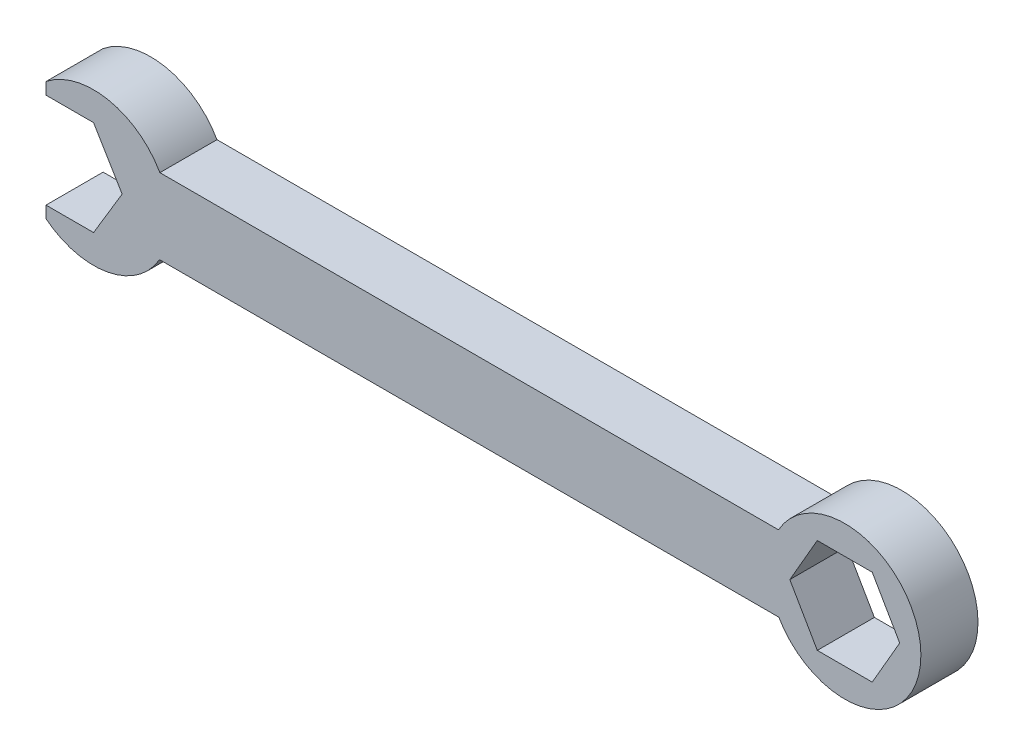
ISO-10303-21;
HEADER;
FILE_DESCRIPTION(('STEP AP214'),'2;1');
FILE_NAME('part.step','',(''),(''),'','','');
FILE_SCHEMA(('AUTOMOTIVE_DESIGN { 1 0 10303 214 1 1 1 1 }'));
ENDSEC;
DATA;
#1=APPLICATION_CONTEXT('core data for automotive mechanical design processes');
#2=APPLICATION_PROTOCOL_DEFINITION('international standard','automotive_design',2000,#1);
#3=PRODUCT_CONTEXT('',#1,'mechanical');
#4=PRODUCT('Part','Part','',(#3));
#5=PRODUCT_RELATED_PRODUCT_CATEGORY('part','',(#4));
#6=PRODUCT_DEFINITION_FORMATION('','',#4);
#7=PRODUCT_DEFINITION_CONTEXT('part definition',#1,'design');
#8=PRODUCT_DEFINITION('design','',#6,#7);
#9=PRODUCT_DEFINITION_SHAPE('','',#8);
#10=(LENGTH_UNIT() NAMED_UNIT(*) SI_UNIT(.MILLI.,.METRE.));
#11=(NAMED_UNIT(*) PLANE_ANGLE_UNIT() SI_UNIT($,.RADIAN.));
#12=(NAMED_UNIT(*) SI_UNIT($,.STERADIAN.) SOLID_ANGLE_UNIT());
#13=UNCERTAINTY_MEASURE_WITH_UNIT(LENGTH_MEASURE(1.E-05),#10,'distance_accuracy_value','');
#14=(GEOMETRIC_REPRESENTATION_CONTEXT(3) GLOBAL_UNCERTAINTY_ASSIGNED_CONTEXT((#13)) GLOBAL_UNIT_ASSIGNED_CONTEXT((#10,
#11,#12)) REPRESENTATION_CONTEXT('',''));
#15=CARTESIAN_POINT('',(0.,0.,0.));
#16=DIRECTION('',(0.,0.,1.));
#17=DIRECTION('',(1.,0.,0.));
#18=AXIS2_PLACEMENT_3D('',#15,#16,#17);
#19=CARTESIAN_POINT('',(0.,4.99620648645434,7.62));
#20=DIRECTION('',(0.,-1.,0.));
#21=DIRECTION('',(1.,0.,0.));
#22=AXIS2_PLACEMENT_3D('',#19,#20,#21);
#23=PLANE('',#22);
#24=DIRECTION('',(-1.,0.,0.));
#25=VECTOR('',#24,1.);
#26=CARTESIAN_POINT('',(0.,4.99620648645434,0.));
#27=LINE('',#26,#25);
#28=CARTESIAN_POINT('',(91.3966672111429,4.99620648645434,0.));
#29=VERTEX_POINT('',#28);
#30=CARTESIAN_POINT('',(8.84666721114294,4.99620648645434,0.));
#31=VERTEX_POINT('',#30);
#32=EDGE_CURVE('E214',#29,#31,#27,.T.);
#33=ORIENTED_EDGE('',*,*,#32,.T.);
#34=DIRECTION('',(0.,0.,-1.));
#35=VECTOR('',#34,1.);
#36=CARTESIAN_POINT('',(8.84666721114294,4.99620648645434,7.62));
#37=LINE('',#36,#35);
#38=CARTESIAN_POINT('',(8.84666721114294,4.99620648645434,7.62));
#39=VERTEX_POINT('',#38);
#40=EDGE_CURVE('E11',#39,#31,#37,.T.);
#41=ORIENTED_EDGE('',*,*,#40,.F.);
#42=DIRECTION('',(-1.,0.,0.));
#43=VECTOR('',#42,1.);
#44=CARTESIAN_POINT('',(0.,4.99620648645434,7.62));
#45=LINE('',#44,#43);
#46=CARTESIAN_POINT('',(91.3966672111429,4.99620648645434,7.62));
#47=VERTEX_POINT('',#46);
#48=EDGE_CURVE('E297',#47,#39,#45,.T.);
#49=ORIENTED_EDGE('',*,*,#48,.F.);
#50=DIRECTION('',(0.,0.,-1.));
#51=VECTOR('',#50,1.);
#52=CARTESIAN_POINT('',(91.3966672111429,4.99620648645434,7.62));
#53=LINE('',#52,#51);
#54=EDGE_CURVE('E239',#47,#29,#53,.T.);
#55=ORIENTED_EDGE('',*,*,#54,.T.);
#56=EDGE_LOOP('',(#33,#41,#49,#55));
#57=FACE_BOUND('',#56,.T.);
#58=ADVANCED_FACE('F43',(#57),#23,.F.);
#59=CARTESIAN_POINT('',(0.,0.,7.62));
#60=DIRECTION('',(0.,0.,-1.));
#61=DIRECTION('',(-1.,0.,0.));
#62=AXIS2_PLACEMENT_3D('',#59,#60,#61);
#63=CYLINDRICAL_SURFACE('',#62,10.16);
#64=CARTESIAN_POINT('',(0.,0.,0.));
#65=DIRECTION('',(0.,0.,1.));
#66=DIRECTION('',(1.,0.,0.));
#67=AXIS2_PLACEMENT_3D('',#64,#65,#66);
#68=CIRCLE('',#67,10.16);
#69=CARTESIAN_POINT('',(-6.35,7.93114745796597,0.));
#70=VERTEX_POINT('',#69);
#71=EDGE_CURVE('E217',#31,#70,#68,.T.);
#72=ORIENTED_EDGE('',*,*,#71,.T.);
#73=DIRECTION('',(0.,0.,-1.));
#74=VECTOR('',#73,1.);
#75=CARTESIAN_POINT('',(-6.35,7.93114745796597,7.62));
#76=LINE('',#75,#74);
#77=CARTESIAN_POINT('',(-6.35,7.93114745796597,7.62));
#78=VERTEX_POINT('',#77);
#79=EDGE_CURVE('E52',#78,#70,#76,.T.);
#80=ORIENTED_EDGE('',*,*,#79,.F.);
#81=CARTESIAN_POINT('',(0.,0.,7.62));
#82=DIRECTION('',(0.,0.,1.));
#83=DIRECTION('',(1.,0.,0.));
#84=AXIS2_PLACEMENT_3D('',#81,#82,#83);
#85=CIRCLE('',#84,10.16);
#86=EDGE_CURVE('E299',#39,#78,#85,.T.);
#87=ORIENTED_EDGE('',*,*,#86,.F.);
#88=ORIENTED_EDGE('',*,*,#40,.T.);
#89=EDGE_LOOP('',(#72,#80,#87,#88));
#90=FACE_BOUND('',#89,.T.);
#91=ADVANCED_FACE('F345',(#90),#63,.T.);
#92=CARTESIAN_POINT('',(-6.35,0.,7.62));
#93=DIRECTION('',(-1.,0.,0.));
#94=DIRECTION('',(0.,0.,1.));
#95=AXIS2_PLACEMENT_3D('',#92,#93,#94);
#96=PLANE('',#95);
#97=DIRECTION('',(0.,1.,0.));
#98=VECTOR('',#97,1.);
#99=CARTESIAN_POINT('',(-6.35,0.,0.));
#100=LINE('',#99,#98);
#101=CARTESIAN_POINT('',(-6.35,6.35,0.));
#102=VERTEX_POINT('',#101);
#103=EDGE_CURVE('E222',#102,#70,#100,.T.);
#104=ORIENTED_EDGE('',*,*,#103,.F.);
#105=DIRECTION('',(0.,0.,-1.));
#106=VECTOR('',#105,1.);
#107=CARTESIAN_POINT('',(-6.35,6.35,7.62));
#108=LINE('',#107,#106);
#109=CARTESIAN_POINT('',(-6.35,6.35,7.62));
#110=VERTEX_POINT('',#109);
#111=EDGE_CURVE('E255',#110,#102,#108,.T.);
#112=ORIENTED_EDGE('',*,*,#111,.F.);
#113=DIRECTION('',(0.,1.,0.));
#114=VECTOR('',#113,1.);
#115=CARTESIAN_POINT('',(-6.35,0.,7.62));
#116=LINE('',#115,#114);
#117=EDGE_CURVE('E305',#110,#78,#116,.T.);
#118=ORIENTED_EDGE('',*,*,#117,.T.);
#119=ORIENTED_EDGE('',*,*,#79,.T.);
#120=EDGE_LOOP('',(#104,#112,#118,#119));
#121=FACE_BOUND('',#120,.T.);
#122=ADVANCED_FACE('F350',(#121),#96,.T.);
#123=CARTESIAN_POINT('',(0.,6.35,7.62));
#124=DIRECTION('',(0.,-1.,0.));
#125=DIRECTION('',(1.,0.,0.));
#126=AXIS2_PLACEMENT_3D('',#123,#124,#125);
#127=PLANE('',#126);
#128=DIRECTION('',(-1.,0.,0.));
#129=VECTOR('',#128,1.);
#130=CARTESIAN_POINT('',(0.,6.35,0.));
#131=LINE('',#130,#129);
#132=CARTESIAN_POINT('',(0.,6.35,0.));
#133=VERTEX_POINT('',#132);
#134=EDGE_CURVE('E221',#133,#102,#131,.T.);
#135=ORIENTED_EDGE('',*,*,#134,.F.);
#136=DIRECTION('',(0.,0.,-1.));
#137=VECTOR('',#136,1.);
#138=CARTESIAN_POINT('',(0.,6.35,7.62));
#139=LINE('',#138,#137);
#140=CARTESIAN_POINT('',(0.,6.35,7.62));
#141=VERTEX_POINT('',#140);
#142=EDGE_CURVE('E252',#141,#133,#139,.T.);
#143=ORIENTED_EDGE('',*,*,#142,.F.);
#144=DIRECTION('',(-1.,0.,0.));
#145=VECTOR('',#144,1.);
#146=CARTESIAN_POINT('',(0.,6.35,7.62));
#147=LINE('',#146,#145);
#148=EDGE_CURVE('E304',#141,#110,#147,.T.);
#149=ORIENTED_EDGE('',*,*,#148,.T.);
#150=ORIENTED_EDGE('',*,*,#111,.T.);
#151=EDGE_LOOP('',(#135,#143,#149,#150));
#152=FACE_BOUND('',#151,.T.);
#153=ADVANCED_FACE('F381',(#152),#127,.T.);
#154=CARTESIAN_POINT('',(2.80147058823529,1.68088235294118,7.62));
#155=DIRECTION('',(0.857492925712544,0.514495755427527,0.));
#156=DIRECTION('',(-0.514495755427527,0.857492925712544,0.));
#157=AXIS2_PLACEMENT_3D('',#154,#155,#156);
#158=PLANE('',#157);
#159=DIRECTION('',(0.514495755427527,-0.857492925712544,0.));
#160=VECTOR('',#159,1.);
#161=CARTESIAN_POINT('',(2.80147058823529,1.68088235294118,0.));
#162=LINE('',#161,#160);
#163=CARTESIAN_POINT('',(3.81,0.,0.));
#164=VERTEX_POINT('',#163);
#165=EDGE_CURVE('E230',#133,#164,#162,.T.);
#166=ORIENTED_EDGE('',*,*,#165,.T.);
#167=DIRECTION('',(0.,0.,-1.));
#168=VECTOR('',#167,1.);
#169=CARTESIAN_POINT('',(3.81,0.,7.62));
#170=LINE('',#169,#168);
#171=CARTESIAN_POINT('',(3.81,0.,7.62));
#172=VERTEX_POINT('',#171);
#173=EDGE_CURVE('E248',#172,#164,#170,.T.);
#174=ORIENTED_EDGE('',*,*,#173,.F.);
#175=DIRECTION('',(0.514495755427527,-0.857492925712544,0.));
#176=VECTOR('',#175,1.);
#177=CARTESIAN_POINT('',(2.80147058823529,1.68088235294118,7.62));
#178=LINE('',#177,#176);
#179=EDGE_CURVE('E306',#141,#172,#178,.T.);
#180=ORIENTED_EDGE('',*,*,#179,.F.);
#181=ORIENTED_EDGE('',*,*,#142,.T.);
#182=EDGE_LOOP('',(#166,#174,#180,#181));
#183=FACE_BOUND('',#182,.T.);
#184=ADVANCED_FACE('F380',(#183),#158,.F.);
#185=CARTESIAN_POINT('',(2.80147058823523,-1.68088235294121,7.62));
#186=DIRECTION('',(0.857492925712534,-0.514495755427543,0.));
#187=DIRECTION('',(0.514495755427543,0.857492925712534,0.));
#188=AXIS2_PLACEMENT_3D('',#185,#186,#187);
#189=PLANE('',#188);
#190=DIRECTION('',(-0.514495755427543,-0.857492925712534,0.));
#191=VECTOR('',#190,1.);
#192=CARTESIAN_POINT('',(2.80147058823523,-1.68088235294121,0.));
#193=LINE('',#192,#191);
#194=CARTESIAN_POINT('',(-1.64798730217797E-13,-6.35,0.));
#195=VERTEX_POINT('',#194);
#196=EDGE_CURVE('E228',#164,#195,#193,.T.);
#197=ORIENTED_EDGE('',*,*,#196,.T.);
#198=DIRECTION('',(0.,0.,-1.));
#199=VECTOR('',#198,1.);
#200=CARTESIAN_POINT('',(-1.64798730217797E-13,-6.35,7.62));
#201=LINE('',#200,#199);
#202=CARTESIAN_POINT('',(-1.64798730217797E-13,-6.35,7.62));
#203=VERTEX_POINT('',#202);
#204=EDGE_CURVE('E246',#203,#195,#201,.T.);
#205=ORIENTED_EDGE('',*,*,#204,.F.);
#206=DIRECTION('',(-0.514495755427543,-0.857492925712534,0.));
#207=VECTOR('',#206,1.);
#208=CARTESIAN_POINT('',(2.80147058823523,-1.68088235294121,7.62));
#209=LINE('',#208,#207);
#210=EDGE_CURVE('E309',#172,#203,#209,.T.);
#211=ORIENTED_EDGE('',*,*,#210,.F.);
#212=ORIENTED_EDGE('',*,*,#173,.T.);
#213=EDGE_LOOP('',(#197,#205,#211,#212));
#214=FACE_BOUND('',#213,.T.);
#215=ADVANCED_FACE('F372',(#214),#189,.F.);
#216=CARTESIAN_POINT('',(0.,-6.35,7.62));
#217=DIRECTION('',(0.,-1.,0.));
#218=DIRECTION('',(0.,0.,-1.));
#219=AXIS2_PLACEMENT_3D('',#216,#217,#218);
#220=PLANE('',#219);
#221=DIRECTION('',(-1.,0.,0.));
#222=VECTOR('',#221,1.);
#223=CARTESIAN_POINT('',(0.,-6.35,0.));
#224=LINE('',#223,#222);
#225=CARTESIAN_POINT('',(-6.35,-6.35,0.));
#226=VERTEX_POINT('',#225);
#227=EDGE_CURVE('E231',#195,#226,#224,.T.);
#228=ORIENTED_EDGE('',*,*,#227,.T.);
#229=DIRECTION('',(0.,0.,-1.));
#230=VECTOR('',#229,1.);
#231=CARTESIAN_POINT('',(-6.35,-6.35,7.62));
#232=LINE('',#231,#230);
#233=CARTESIAN_POINT('',(-6.35,-6.35,7.62));
#234=VERTEX_POINT('',#233);
#235=EDGE_CURVE('E242',#234,#226,#232,.T.);
#236=ORIENTED_EDGE('',*,*,#235,.F.);
#237=DIRECTION('',(-1.,0.,0.));
#238=VECTOR('',#237,1.);
#239=CARTESIAN_POINT('',(0.,-6.35,7.62));
#240=LINE('',#239,#238);
#241=EDGE_CURVE('E315',#203,#234,#240,.T.);
#242=ORIENTED_EDGE('',*,*,#241,.F.);
#243=ORIENTED_EDGE('',*,*,#204,.T.);
#244=EDGE_LOOP('',(#228,#236,#242,#243));
#245=FACE_BOUND('',#244,.T.);
#246=ADVANCED_FACE('F318',(#245),#220,.F.);
#247=CARTESIAN_POINT('',(-6.35,0.,7.62));
#248=DIRECTION('',(1.,0.,0.));
#249=DIRECTION('',(0.,0.,-1.));
#250=AXIS2_PLACEMENT_3D('',#247,#248,#249);
#251=PLANE('',#250);
#252=DIRECTION('',(0.,-1.,0.));
#253=VECTOR('',#252,1.);
#254=CARTESIAN_POINT('',(-6.35,0.,0.));
#255=LINE('',#254,#253);
#256=CARTESIAN_POINT('',(-6.35,-7.93114745796597,0.));
#257=VERTEX_POINT('',#256);
#258=EDGE_CURVE('E232',#226,#257,#255,.T.);
#259=ORIENTED_EDGE('',*,*,#258,.T.);
#260=DIRECTION('',(0.,0.,-1.));
#261=VECTOR('',#260,1.);
#262=CARTESIAN_POINT('',(-6.35,-7.93114745796597,7.62));
#263=LINE('',#262,#261);
#264=CARTESIAN_POINT('',(-6.35,-7.93114745796597,7.62));
#265=VERTEX_POINT('',#264);
#266=EDGE_CURVE('E187',#265,#257,#263,.T.);
#267=ORIENTED_EDGE('',*,*,#266,.F.);
#268=DIRECTION('',(0.,-1.,0.));
#269=VECTOR('',#268,1.);
#270=CARTESIAN_POINT('',(-6.35,0.,7.62));
#271=LINE('',#270,#269);
#272=EDGE_CURVE('E178',#234,#265,#271,.T.);
#273=ORIENTED_EDGE('',*,*,#272,.F.);
#274=ORIENTED_EDGE('',*,*,#235,.T.);
#275=EDGE_LOOP('',(#259,#267,#273,#274));
#276=FACE_BOUND('',#275,.T.);
#277=ADVANCED_FACE('F325',(#276),#251,.F.);
#278=CARTESIAN_POINT('',(0.,0.,7.62));
#279=DIRECTION('',(0.,0.,-1.));
#280=DIRECTION('',(-1.,0.,0.));
#281=AXIS2_PLACEMENT_3D('',#278,#279,#280);
#282=CYLINDRICAL_SURFACE('',#281,10.16);
#283=CARTESIAN_POINT('',(0.,0.,0.));
#284=DIRECTION('',(0.,0.,1.));
#285=DIRECTION('',(1.,0.,0.));
#286=AXIS2_PLACEMENT_3D('',#283,#284,#285);
#287=CIRCLE('',#286,10.16);
#288=CARTESIAN_POINT('',(8.79881810245076,-5.0799999999985,0.));
#289=VERTEX_POINT('',#288);
#290=EDGE_CURVE('E190',#257,#289,#287,.T.);
#291=ORIENTED_EDGE('',*,*,#290,.T.);
#292=DIRECTION('',(0.,0.,-1.));
#293=VECTOR('',#292,1.);
#294=CARTESIAN_POINT('',(8.79881810245076,-5.0799999999985,7.62));
#295=LINE('',#294,#293);
#296=CARTESIAN_POINT('',(8.79881810245076,-5.0799999999985,7.62));
#297=VERTEX_POINT('',#296);
#298=EDGE_CURVE('E184',#297,#289,#295,.T.);
#299=ORIENTED_EDGE('',*,*,#298,.F.);
#300=CARTESIAN_POINT('',(0.,0.,7.62));
#301=DIRECTION('',(0.,0.,1.));
#302=DIRECTION('',(1.,0.,0.));
#303=AXIS2_PLACEMENT_3D('',#300,#301,#302);
#304=CIRCLE('',#303,10.16);
#305=EDGE_CURVE('E172',#265,#297,#304,.T.);
#306=ORIENTED_EDGE('',*,*,#305,.F.);
#307=ORIENTED_EDGE('',*,*,#266,.T.);
#308=EDGE_LOOP('',(#291,#299,#306,#307));
#309=FACE_BOUND('',#308,.T.);
#310=ADVANCED_FACE('F183',(#309),#282,.T.);
#311=CARTESIAN_POINT('',(0.,-5.0799999999985,7.62));
#312=DIRECTION('',(0.,1.,0.));
#313=DIRECTION('',(-1.,0.,0.));
#314=AXIS2_PLACEMENT_3D('',#311,#312,#313);
#315=PLANE('',#314);
#316=DIRECTION('',(1.,0.,0.));
#317=VECTOR('',#316,1.);
#318=CARTESIAN_POINT('',(0.,-5.0799999999985,0.));
#319=LINE('',#318,#317);
#320=CARTESIAN_POINT('',(91.4445163198351,-5.0799999999985,0.));
#321=VERTEX_POINT('',#320);
#322=EDGE_CURVE('E117',#289,#321,#319,.T.);
#323=ORIENTED_EDGE('',*,*,#322,.T.);
#324=DIRECTION('',(0.,0.,-1.));
#325=VECTOR('',#324,1.);
#326=CARTESIAN_POINT('',(91.4445163198351,-5.0799999999985,7.62));
#327=LINE('',#326,#325);
#328=CARTESIAN_POINT('',(91.4445163198351,-5.0799999999985,7.62));
#329=VERTEX_POINT('',#328);
#330=EDGE_CURVE('E188',#329,#321,#327,.T.);
#331=ORIENTED_EDGE('',*,*,#330,.F.);
#332=DIRECTION('',(1.,0.,0.));
#333=VECTOR('',#332,1.);
#334=CARTESIAN_POINT('',(0.,-5.0799999999985,7.62));
#335=LINE('',#334,#333);
#336=EDGE_CURVE('E180',#297,#329,#335,.T.);
#337=ORIENTED_EDGE('',*,*,#336,.F.);
#338=ORIENTED_EDGE('',*,*,#298,.T.);
#339=EDGE_LOOP('',(#323,#331,#337,#338));
#340=FACE_BOUND('',#339,.T.);
#341=ADVANCED_FACE('F191',(#340),#315,.F.);
#342=CARTESIAN_POINT('',(69.6832395026833,40.2316370848793,7.62));
#343=DIRECTION('',(0.866025403784439,0.499999999999999,0.));
#344=DIRECTION('',(-0.499999999999999,0.866025403784439,0.));
#345=AXIS2_PLACEMENT_3D('',#342,#343,#344);
#346=PLANE('',#345);
#347=DIRECTION('',(0.499999999999999,-0.866025403784439,0.));
#348=VECTOR('',#347,1.);
#349=CARTESIAN_POINT('',(69.6832395026833,40.2316370848793,0.));
#350=LINE('',#349,#348);
#351=CARTESIAN_POINT('',(92.9109860035776,0.,0.));
#352=VERTEX_POINT('',#351);
#353=CARTESIAN_POINT('',(96.5771602129317,-6.35,0.));
#354=VERTEX_POINT('',#353);
#355=EDGE_CURVE('E197',#352,#354,#350,.T.);
#356=ORIENTED_EDGE('',*,*,#355,.F.);
#357=DIRECTION('',(0.,0.,-1.));
#358=VECTOR('',#357,1.);
#359=CARTESIAN_POINT('',(92.9109860035776,0.,7.62));
#360=LINE('',#359,#358);
#361=CARTESIAN_POINT('',(92.9109860035776,0.,7.62));
#362=VERTEX_POINT('',#361);
#363=EDGE_CURVE('E50',#362,#352,#360,.T.);
#364=ORIENTED_EDGE('',*,*,#363,.F.);
#365=DIRECTION('',(0.499999999999999,-0.866025403784439,0.));
#366=VECTOR('',#365,1.);
#367=CARTESIAN_POINT('',(69.6832395026833,40.2316370848793,7.62));
#368=LINE('',#367,#366);
#369=CARTESIAN_POINT('',(96.5771602129317,-6.35,7.62));
#370=VERTEX_POINT('',#369);
#371=EDGE_CURVE('E236',#362,#370,#368,.T.);
#372=ORIENTED_EDGE('',*,*,#371,.T.);
#373=DIRECTION('',(0.,0.,-1.));
#374=VECTOR('',#373,1.);
#375=CARTESIAN_POINT('',(96.5771602129317,-6.35,7.62));
#376=LINE('',#375,#374);
#377=EDGE_CURVE('E192',#370,#354,#376,.T.);
#378=ORIENTED_EDGE('',*,*,#377,.T.);
#379=EDGE_LOOP('',(#356,#364,#372,#378));
#380=FACE_BOUND('',#379,.T.);
#381=ADVANCED_FACE('F44',(#380),#346,.T.);
#382=CARTESIAN_POINT('',(69.6832395026832,-40.2316370848793,7.62));
#383=DIRECTION('',(0.866025403784439,-0.5,0.));
#384=DIRECTION('',(0.5,0.866025403784439,0.));
#385=AXIS2_PLACEMENT_3D('',#382,#383,#384);
#386=PLANE('',#385);
#387=DIRECTION('',(-0.5,-0.866025403784439,0.));
#388=VECTOR('',#387,1.);
#389=CARTESIAN_POINT('',(69.6832395026832,-40.2316370848793,0.));
#390=LINE('',#389,#388);
#391=CARTESIAN_POINT('',(96.5771602129317,6.35,0.));
#392=VERTEX_POINT('',#391);
#393=EDGE_CURVE('E199',#392,#352,#390,.T.);
#394=ORIENTED_EDGE('',*,*,#393,.F.);
#395=DIRECTION('',(0.,0.,-1.));
#396=VECTOR('',#395,1.);
#397=CARTESIAN_POINT('',(96.5771602129317,6.35,7.62));
#398=LINE('',#397,#396);
#399=CARTESIAN_POINT('',(96.5771602129317,6.35,7.62));
#400=VERTEX_POINT('',#399);
#401=EDGE_CURVE('E263',#400,#392,#398,.T.);
#402=ORIENTED_EDGE('',*,*,#401,.F.);
#403=DIRECTION('',(-0.5,-0.866025403784439,0.));
#404=VECTOR('',#403,1.);
#405=CARTESIAN_POINT('',(69.6832395026832,-40.2316370848793,7.62));
#406=LINE('',#405,#404);
#407=EDGE_CURVE('E275',#400,#362,#406,.T.);
#408=ORIENTED_EDGE('',*,*,#407,.T.);
#409=ORIENTED_EDGE('',*,*,#363,.T.);
#410=EDGE_LOOP('',(#394,#402,#408,#409));
#411=FACE_BOUND('',#410,.T.);
#412=ADVANCED_FACE('F269',(#411),#386,.T.);
#413=CARTESIAN_POINT('',(0.,6.34999999999975,7.62));
#414=DIRECTION('',(0.,1.,0.));
#415=DIRECTION('',(-1.,0.,0.));
#416=AXIS2_PLACEMENT_3D('',#413,#414,#415);
#417=PLANE('',#416);
#418=DIRECTION('',(1.,0.,0.));
#419=VECTOR('',#418,1.);
#420=CARTESIAN_POINT('',(0.,6.34999999999975,0.));
#421=LINE('',#420,#419);
#422=CARTESIAN_POINT('',(103.90950863164,6.35000000000002,0.));
#423=VERTEX_POINT('',#422);
#424=EDGE_CURVE('E201',#392,#423,#421,.T.);
#425=ORIENTED_EDGE('',*,*,#424,.T.);
#426=DIRECTION('',(0.,0.,-1.));
#427=VECTOR('',#426,1.);
#428=CARTESIAN_POINT('',(103.90950863164,6.35000000000002,7.62));
#429=LINE('',#428,#427);
#430=CARTESIAN_POINT('',(103.90950863164,6.35000000000002,7.62));
#431=VERTEX_POINT('',#430);
#432=EDGE_CURVE('E265',#431,#423,#429,.T.);
#433=ORIENTED_EDGE('',*,*,#432,.F.);
#434=DIRECTION('',(1.,0.,0.));
#435=VECTOR('',#434,1.);
#436=CARTESIAN_POINT('',(0.,6.34999999999975,7.62));
#437=LINE('',#436,#435);
#438=EDGE_CURVE('E281',#400,#431,#437,.T.);
#439=ORIENTED_EDGE('',*,*,#438,.F.);
#440=ORIENTED_EDGE('',*,*,#401,.T.);
#441=EDGE_LOOP('',(#425,#433,#439,#440));
#442=FACE_BOUND('',#441,.T.);
#443=ADVANCED_FACE('F276',(#442),#417,.F.);
#444=CARTESIAN_POINT('',(80.6817621307459,46.5816370848792,7.62));
#445=DIRECTION('',(-0.86602540378444,-0.499999999999997,0.));
#446=DIRECTION('',(0.499999999999997,-0.86602540378444,0.));
#447=AXIS2_PLACEMENT_3D('',#444,#445,#446);
#448=PLANE('',#447);
#449=DIRECTION('',(-0.499999999999997,0.86602540378444,0.));
#450=VECTOR('',#449,1.);
#451=CARTESIAN_POINT('',(80.6817621307459,46.5816370848792,0.));
#452=LINE('',#451,#450);
#453=CARTESIAN_POINT('',(107.575682840994,0.,0.));
#454=VERTEX_POINT('',#453);
#455=EDGE_CURVE('E206',#454,#423,#452,.T.);
#456=ORIENTED_EDGE('',*,*,#455,.F.);
#457=DIRECTION('',(0.,0.,-1.));
#458=VECTOR('',#457,1.);
#459=CARTESIAN_POINT('',(107.575682840994,0.,7.62));
#460=LINE('',#459,#458);
#461=CARTESIAN_POINT('',(107.575682840994,0.,7.62));
#462=VERTEX_POINT('',#461);
#463=EDGE_CURVE('E257',#462,#454,#460,.T.);
#464=ORIENTED_EDGE('',*,*,#463,.F.);
#465=DIRECTION('',(-0.499999999999997,0.86602540378444,0.));
#466=VECTOR('',#465,1.);
#467=CARTESIAN_POINT('',(80.6817621307459,46.5816370848792,7.62));
#468=LINE('',#467,#466);
#469=EDGE_CURVE('E283',#462,#431,#468,.T.);
#470=ORIENTED_EDGE('',*,*,#469,.T.);
#471=ORIENTED_EDGE('',*,*,#432,.T.);
#472=EDGE_LOOP('',(#456,#464,#470,#471));
#473=FACE_BOUND('',#472,.T.);
#474=ADVANCED_FACE('F284',(#473),#448,.T.);
#475=CARTESIAN_POINT('',(80.6817621307454,-46.5816370848795,7.62));
#476=DIRECTION('',(-0.866025403784438,0.500000000000002,0.));
#477=DIRECTION('',(-0.500000000000002,-0.866025403784437,0.));
#478=AXIS2_PLACEMENT_3D('',#475,#476,#477);
#479=PLANE('',#478);
#480=DIRECTION('',(0.500000000000002,0.866025403784438,0.));
#481=VECTOR('',#480,1.);
#482=CARTESIAN_POINT('',(80.6817621307454,-46.5816370848795,0.));
#483=LINE('',#482,#481);
#484=CARTESIAN_POINT('',(103.90950863164,-6.34999999999998,0.));
#485=VERTEX_POINT('',#484);
#486=EDGE_CURVE('E207',#485,#454,#483,.T.);
#487=ORIENTED_EDGE('',*,*,#486,.F.);
#488=DIRECTION('',(0.,0.,-1.));
#489=VECTOR('',#488,1.);
#490=CARTESIAN_POINT('',(103.90950863164,-6.34999999999998,7.62));
#491=LINE('',#490,#489);
#492=CARTESIAN_POINT('',(103.90950863164,-6.34999999999998,7.62));
#493=VERTEX_POINT('',#492);
#494=EDGE_CURVE('E256',#493,#485,#491,.T.);
#495=ORIENTED_EDGE('',*,*,#494,.F.);
#496=DIRECTION('',(0.500000000000002,0.866025403784438,0.));
#497=VECTOR('',#496,1.);
#498=CARTESIAN_POINT('',(80.6817621307454,-46.5816370848795,7.62));
#499=LINE('',#498,#497);
#500=EDGE_CURVE('E288',#493,#462,#499,.T.);
#501=ORIENTED_EDGE('',*,*,#500,.T.);
#502=ORIENTED_EDGE('',*,*,#463,.T.);
#503=EDGE_LOOP('',(#487,#495,#501,#502));
#504=FACE_BOUND('',#503,.T.);
#505=ADVANCED_FACE('F336',(#504),#479,.T.);
#506=CARTESIAN_POINT('',(0.,-6.35000000000034,7.62));
#507=DIRECTION('',(0.,1.,0.));
#508=DIRECTION('',(-1.,0.,0.));
#509=AXIS2_PLACEMENT_3D('',#506,#507,#508);
#510=PLANE('',#509);
#511=DIRECTION('',(1.,0.,0.));
#512=VECTOR('',#511,1.);
#513=CARTESIAN_POINT('',(0.,-6.35000000000034,0.));
#514=LINE('',#513,#512);
#515=EDGE_CURVE('E215',#354,#485,#514,.T.);
#516=ORIENTED_EDGE('',*,*,#515,.F.);
#517=ORIENTED_EDGE('',*,*,#377,.F.);
#518=DIRECTION('',(1.,0.,0.));
#519=VECTOR('',#518,1.);
#520=CARTESIAN_POINT('',(0.,-6.35000000000034,7.62));
#521=LINE('',#520,#519);
#522=EDGE_CURVE('E292',#370,#493,#521,.T.);
#523=ORIENTED_EDGE('',*,*,#522,.T.);
#524=ORIENTED_EDGE('',*,*,#494,.T.);
#525=EDGE_LOOP('',(#516,#517,#523,#524));
#526=FACE_BOUND('',#525,.T.);
#527=ADVANCED_FACE('F328',(#526),#510,.T.);
#528=CARTESIAN_POINT('',(100.243334422286,0.,7.62));
#529=DIRECTION('',(0.,0.,-1.));
#530=DIRECTION('',(-1.,0.,0.));
#531=AXIS2_PLACEMENT_3D('',#528,#529,#530);
#532=CYLINDRICAL_SURFACE('',#531,10.16);
#533=CARTESIAN_POINT('',(100.243334422286,0.,0.));
#534=DIRECTION('',(0.,0.,1.));
#535=DIRECTION('',(1.,0.,0.));
#536=AXIS2_PLACEMENT_3D('',#533,#534,#535);
#537=CIRCLE('',#536,10.16);
#538=EDGE_CURVE('E123',#321,#29,#537,.T.);
#539=ORIENTED_EDGE('',*,*,#538,.T.);
#540=ORIENTED_EDGE('',*,*,#54,.F.);
#541=CARTESIAN_POINT('',(100.243334422286,0.,7.62));
#542=DIRECTION('',(0.,0.,1.));
#543=DIRECTION('',(1.,0.,0.));
#544=AXIS2_PLACEMENT_3D('',#541,#542,#543);
#545=CIRCLE('',#544,10.16);
#546=EDGE_CURVE('E65',#329,#47,#545,.T.);
#547=ORIENTED_EDGE('',*,*,#546,.F.);
#548=ORIENTED_EDGE('',*,*,#330,.T.);
#549=EDGE_LOOP('',(#539,#540,#547,#548));
#550=FACE_BOUND('',#549,.T.);
#551=ADVANCED_FACE('F330',(#550),#532,.T.);
#552=CARTESIAN_POINT('',(0.,0.,7.62));
#553=DIRECTION('',(0.,0.,1.));
#554=DIRECTION('',(1.,0.,0.));
#555=AXIS2_PLACEMENT_3D('',#552,#553,#554);
#556=PLANE('',#555);
#557=ORIENTED_EDGE('',*,*,#371,.F.);
#558=ORIENTED_EDGE('',*,*,#407,.F.);
#559=ORIENTED_EDGE('',*,*,#438,.T.);
#560=ORIENTED_EDGE('',*,*,#469,.F.);
#561=ORIENTED_EDGE('',*,*,#500,.F.);
#562=ORIENTED_EDGE('',*,*,#522,.F.);
#563=EDGE_LOOP('',(#557,#558,#559,#560,#561,#562));
#564=FACE_BOUND('',#563,.T.);
#565=ORIENTED_EDGE('',*,*,#48,.T.);
#566=ORIENTED_EDGE('',*,*,#86,.T.);
#567=ORIENTED_EDGE('',*,*,#117,.F.);
#568=ORIENTED_EDGE('',*,*,#148,.F.);
#569=ORIENTED_EDGE('',*,*,#179,.T.);
#570=ORIENTED_EDGE('',*,*,#210,.T.);
#571=ORIENTED_EDGE('',*,*,#241,.T.);
#572=ORIENTED_EDGE('',*,*,#272,.T.);
#573=ORIENTED_EDGE('',*,*,#305,.T.);
#574=ORIENTED_EDGE('',*,*,#336,.T.);
#575=ORIENTED_EDGE('',*,*,#546,.T.);
#576=EDGE_LOOP('',(#565,#566,#567,#568,#569,#570,#571,#572,#573,#574,#575));
#577=FACE_BOUND('',#576,.T.);
#578=ADVANCED_FACE('F174',(#564,#577),#556,.T.);
#579=CARTESIAN_POINT('',(0.,0.,0.));
#580=DIRECTION('',(0.,0.,1.));
#581=DIRECTION('',(1.,0.,0.));
#582=AXIS2_PLACEMENT_3D('',#579,#580,#581);
#583=PLANE('',#582);
#584=ORIENTED_EDGE('',*,*,#355,.T.);
#585=ORIENTED_EDGE('',*,*,#515,.T.);
#586=ORIENTED_EDGE('',*,*,#486,.T.);
#587=ORIENTED_EDGE('',*,*,#455,.T.);
#588=ORIENTED_EDGE('',*,*,#424,.F.);
#589=ORIENTED_EDGE('',*,*,#393,.T.);
#590=EDGE_LOOP('',(#584,#585,#586,#587,#588,#589));
#591=FACE_BOUND('',#590,.T.);
#592=ORIENTED_EDGE('',*,*,#32,.F.);
#593=ORIENTED_EDGE('',*,*,#538,.F.);
#594=ORIENTED_EDGE('',*,*,#322,.F.);
#595=ORIENTED_EDGE('',*,*,#290,.F.);
#596=ORIENTED_EDGE('',*,*,#258,.F.);
#597=ORIENTED_EDGE('',*,*,#227,.F.);
#598=ORIENTED_EDGE('',*,*,#196,.F.);
#599=ORIENTED_EDGE('',*,*,#165,.F.);
#600=ORIENTED_EDGE('',*,*,#134,.T.);
#601=ORIENTED_EDGE('',*,*,#103,.T.);
#602=ORIENTED_EDGE('',*,*,#71,.F.);
#603=EDGE_LOOP('',(#592,#593,#594,#595,#596,#597,#598,#599,#600,#601,#602));
#604=FACE_BOUND('',#603,.T.);
#605=ADVANCED_FACE('F274',(#591,#604),#583,.F.);
#606=CLOSED_SHELL('',(#58,#91,#122,#153,#184,#215,#246,#277,#310,#341,#381,#412,#443,#474,#505,
#527,#551,#578,#605));
#607=MANIFOLD_SOLID_BREP('B2',#606);
#608=ADVANCED_BREP_SHAPE_REPRESENTATION('',(#18,#607),#14);
#609=SHAPE_DEFINITION_REPRESENTATION(#9,#608);
ENDSEC;
END-ISO-10303-21;
